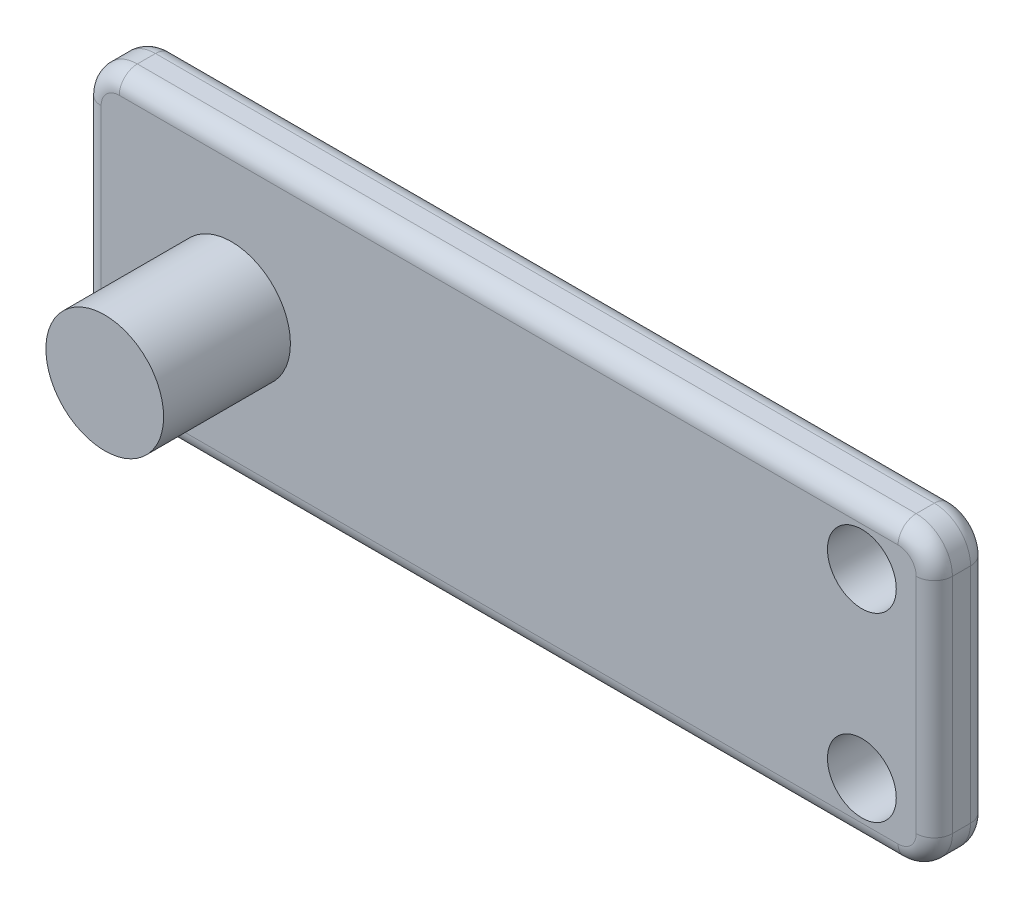
ISO-10303-21;
HEADER;
FILE_DESCRIPTION(('STEP AP214'),'2;1');
FILE_NAME('part.step','',(''),(''),'','','');
FILE_SCHEMA(('AUTOMOTIVE_DESIGN { 1 0 10303 214 1 1 1 1 }'));
ENDSEC;
DATA;
#1=APPLICATION_CONTEXT('core data for automotive mechanical design processes');
#2=APPLICATION_PROTOCOL_DEFINITION('international standard','automotive_design',2000,#1);
#3=PRODUCT_CONTEXT('',#1,'mechanical');
#4=PRODUCT('Part','Part','',(#3));
#5=PRODUCT_RELATED_PRODUCT_CATEGORY('part','',(#4));
#6=PRODUCT_DEFINITION_FORMATION('','',#4);
#7=PRODUCT_DEFINITION_CONTEXT('part definition',#1,'design');
#8=PRODUCT_DEFINITION('design','',#6,#7);
#9=PRODUCT_DEFINITION_SHAPE('','',#8);
#10=(LENGTH_UNIT() NAMED_UNIT(*) SI_UNIT(.MILLI.,.METRE.));
#11=(NAMED_UNIT(*) PLANE_ANGLE_UNIT() SI_UNIT($,.RADIAN.));
#12=(NAMED_UNIT(*) SI_UNIT($,.STERADIAN.) SOLID_ANGLE_UNIT());
#13=UNCERTAINTY_MEASURE_WITH_UNIT(LENGTH_MEASURE(1.E-05),#10,'distance_accuracy_value','');
#14=(GEOMETRIC_REPRESENTATION_CONTEXT(3) GLOBAL_UNCERTAINTY_ASSIGNED_CONTEXT((#13)) GLOBAL_UNIT_ASSIGNED_CONTEXT((#10,
#11,#12)) REPRESENTATION_CONTEXT('',''));
#15=CARTESIAN_POINT('',(0.,0.,0.));
#16=DIRECTION('',(0.,0.,1.));
#17=DIRECTION('',(1.,0.,0.));
#18=AXIS2_PLACEMENT_3D('',#15,#16,#17);
#19=CARTESIAN_POINT('',(0.,0.,3.));
#20=DIRECTION('',(0.,0.,1.));
#21=DIRECTION('',(1.,0.,0.));
#22=AXIS2_PLACEMENT_3D('',#19,#20,#21);
#23=PLANE('',#22);
#24=CARTESIAN_POINT('',(-15.3,0.,3.));
#25=DIRECTION('',(0.,0.,1.));
#26=DIRECTION('',(1.,0.,0.));
#27=AXIS2_PLACEMENT_3D('',#24,#25,#26);
#28=CIRCLE('',#27,3.25);
#29=CARTESIAN_POINT('',(-12.05,0.,3.));
#30=VERTEX_POINT('',#29);
#31=EDGE_CURVE('E728',#30,#30,#28,.F.);
#32=ORIENTED_EDGE('',*,*,#31,.T.);
#33=EDGE_LOOP('',(#32));
#34=FACE_BOUND('',#33,.T.);
#35=CARTESIAN_POINT('',(19.5,5.,3.));
#36=DIRECTION('',(0.,0.,1.));
#37=DIRECTION('',(1.,0.,0.));
#38=AXIS2_PLACEMENT_3D('',#35,#36,#37);
#39=CIRCLE('',#38,1.9);
#40=CARTESIAN_POINT('',(21.4,5.,3.));
#41=VERTEX_POINT('',#40);
#42=EDGE_CURVE('E701',#41,#41,#39,.T.);
#43=ORIENTED_EDGE('',*,*,#42,.F.);
#44=EDGE_LOOP('',(#43));
#45=FACE_BOUND('',#44,.T.);
#46=CARTESIAN_POINT('',(19.5,-5.,3.));
#47=DIRECTION('',(0.,0.,1.));
#48=DIRECTION('',(1.,0.,0.));
#49=AXIS2_PLACEMENT_3D('',#46,#47,#48);
#50=CIRCLE('',#49,1.9);
#51=CARTESIAN_POINT('',(21.4,-5.,3.));
#52=VERTEX_POINT('',#51);
#53=EDGE_CURVE('E706',#52,#52,#50,.T.);
#54=ORIENTED_EDGE('',*,*,#53,.F.);
#55=EDGE_LOOP('',(#54));
#56=FACE_BOUND('',#55,.T.);
#57=CARTESIAN_POINT('',(-21.5,-6.15,3.));
#58=DIRECTION('',(0.,0.,1.));
#59=DIRECTION('',(1.,0.,0.));
#60=AXIS2_PLACEMENT_3D('',#57,#58,#59);
#61=CIRCLE('',#60,1.);
#62=CARTESIAN_POINT('',(-21.5,-7.15,3.));
#63=VERTEX_POINT('',#62);
#64=CARTESIAN_POINT('',(-22.5,-6.15,3.));
#65=VERTEX_POINT('',#64);
#66=EDGE_CURVE('E319',#63,#65,#61,.F.);
#67=ORIENTED_EDGE('',*,*,#66,.F.);
#68=DIRECTION('',(1.,0.,0.));
#69=VECTOR('',#68,1.);
#70=CARTESIAN_POINT('',(23.5,-7.15,3.));
#71=LINE('',#70,#69);
#72=CARTESIAN_POINT('',(21.5,-7.15,3.));
#73=VERTEX_POINT('',#72);
#74=EDGE_CURVE('E279',#63,#73,#71,.T.);
#75=ORIENTED_EDGE('',*,*,#74,.T.);
#76=CARTESIAN_POINT('',(21.5,-6.15,3.));
#77=DIRECTION('',(0.,0.,1.));
#78=DIRECTION('',(1.,0.,0.));
#79=AXIS2_PLACEMENT_3D('',#76,#77,#78);
#80=CIRCLE('',#79,1.);
#81=CARTESIAN_POINT('',(22.5,-6.15,3.));
#82=VERTEX_POINT('',#81);
#83=EDGE_CURVE('E277',#82,#73,#80,.F.);
#84=ORIENTED_EDGE('',*,*,#83,.F.);
#85=DIRECTION('',(0.,1.,0.));
#86=VECTOR('',#85,1.);
#87=CARTESIAN_POINT('',(22.5,8.15,3.));
#88=LINE('',#87,#86);
#89=CARTESIAN_POINT('',(22.5,6.15,3.));
#90=VERTEX_POINT('',#89);
#91=EDGE_CURVE('E270',#82,#90,#88,.T.);
#92=ORIENTED_EDGE('',*,*,#91,.T.);
#93=CARTESIAN_POINT('',(21.5,6.15,3.));
#94=DIRECTION('',(0.,0.,1.));
#95=DIRECTION('',(1.,0.,0.));
#96=AXIS2_PLACEMENT_3D('',#93,#94,#95);
#97=CIRCLE('',#96,1.);
#98=CARTESIAN_POINT('',(21.5,7.15,3.));
#99=VERTEX_POINT('',#98);
#100=EDGE_CURVE('E267',#99,#90,#97,.F.);
#101=ORIENTED_EDGE('',*,*,#100,.F.);
#102=DIRECTION('',(-1.,0.,0.));
#103=VECTOR('',#102,1.);
#104=CARTESIAN_POINT('',(-23.5,7.15,3.));
#105=LINE('',#104,#103);
#106=CARTESIAN_POINT('',(-21.5,7.15,3.));
#107=VERTEX_POINT('',#106);
#108=EDGE_CURVE('E293',#99,#107,#105,.T.);
#109=ORIENTED_EDGE('',*,*,#108,.T.);
#110=CARTESIAN_POINT('',(-21.5,6.15,3.));
#111=DIRECTION('',(0.,0.,1.));
#112=DIRECTION('',(1.,0.,0.));
#113=AXIS2_PLACEMENT_3D('',#110,#111,#112);
#114=CIRCLE('',#113,1.);
#115=CARTESIAN_POINT('',(-22.5,6.15,3.));
#116=VERTEX_POINT('',#115);
#117=EDGE_CURVE('E315',#116,#107,#114,.F.);
#118=ORIENTED_EDGE('',*,*,#117,.F.);
#119=DIRECTION('',(0.,-1.,0.));
#120=VECTOR('',#119,1.);
#121=CARTESIAN_POINT('',(-22.5,-8.15,3.));
#122=LINE('',#121,#120);
#123=EDGE_CURVE('E284',#116,#65,#122,.T.);
#124=ORIENTED_EDGE('',*,*,#123,.T.);
#125=EDGE_LOOP('',(#67,#75,#84,#92,#101,#109,#118,#124));
#126=FACE_BOUND('',#125,.T.);
#127=ADVANCED_FACE('F47',(#34,#45,#56,#126),#23,.T.);
#128=CARTESIAN_POINT('',(0.,0.,0.));
#129=DIRECTION('',(0.,0.,1.));
#130=DIRECTION('',(1.,0.,0.));
#131=AXIS2_PLACEMENT_3D('',#128,#129,#130);
#132=PLANE('',#131);
#133=CARTESIAN_POINT('',(19.5,5.,0.));
#134=DIRECTION('',(0.,0.,1.));
#135=DIRECTION('',(1.,0.,0.));
#136=AXIS2_PLACEMENT_3D('',#133,#134,#135);
#137=CIRCLE('',#136,1.9);
#138=CARTESIAN_POINT('',(21.4,5.,0.));
#139=VERTEX_POINT('',#138);
#140=EDGE_CURVE('E704',#139,#139,#137,.T.);
#141=ORIENTED_EDGE('',*,*,#140,.T.);
#142=EDGE_LOOP('',(#141));
#143=FACE_BOUND('',#142,.T.);
#144=CARTESIAN_POINT('',(19.5,-5.,0.));
#145=DIRECTION('',(0.,0.,1.));
#146=DIRECTION('',(1.,0.,0.));
#147=AXIS2_PLACEMENT_3D('',#144,#145,#146);
#148=CIRCLE('',#147,1.9);
#149=CARTESIAN_POINT('',(21.4,-5.,0.));
#150=VERTEX_POINT('',#149);
#151=EDGE_CURVE('E712',#150,#150,#148,.T.);
#152=ORIENTED_EDGE('',*,*,#151,.T.);
#153=EDGE_LOOP('',(#152));
#154=FACE_BOUND('',#153,.T.);
#155=CARTESIAN_POINT('',(-21.5,-6.15,0.));
#156=DIRECTION('',(0.,0.,1.));
#157=DIRECTION('',(1.,0.,0.));
#158=AXIS2_PLACEMENT_3D('',#155,#156,#157);
#159=CIRCLE('',#158,1.);
#160=CARTESIAN_POINT('',(-22.5,-6.15,0.));
#161=VERTEX_POINT('',#160);
#162=CARTESIAN_POINT('',(-21.5,-7.15,0.));
#163=VERTEX_POINT('',#162);
#164=EDGE_CURVE('E176',#161,#163,#159,.T.);
#165=ORIENTED_EDGE('',*,*,#164,.F.);
#166=DIRECTION('',(0.,-1.,0.));
#167=VECTOR('',#166,1.);
#168=CARTESIAN_POINT('',(-22.5,0.,0.));
#169=LINE('',#168,#167);
#170=CARTESIAN_POINT('',(-22.5,6.15,0.));
#171=VERTEX_POINT('',#170);
#172=EDGE_CURVE('E170',#161,#171,#169,.F.);
#173=ORIENTED_EDGE('',*,*,#172,.T.);
#174=CARTESIAN_POINT('',(-21.5,6.15,0.));
#175=DIRECTION('',(0.,0.,1.));
#176=DIRECTION('',(1.,0.,0.));
#177=AXIS2_PLACEMENT_3D('',#174,#175,#176);
#178=CIRCLE('',#177,1.);
#179=CARTESIAN_POINT('',(-21.5,7.15,0.));
#180=VERTEX_POINT('',#179);
#181=EDGE_CURVE('E164',#180,#171,#178,.T.);
#182=ORIENTED_EDGE('',*,*,#181,.F.);
#183=DIRECTION('',(-1.,0.,0.));
#184=VECTOR('',#183,1.);
#185=CARTESIAN_POINT('',(0.,7.15,0.));
#186=LINE('',#185,#184);
#187=CARTESIAN_POINT('',(21.5,7.15,0.));
#188=VERTEX_POINT('',#187);
#189=EDGE_CURVE('E168',#180,#188,#186,.F.);
#190=ORIENTED_EDGE('',*,*,#189,.T.);
#191=CARTESIAN_POINT('',(21.5,6.15,0.));
#192=DIRECTION('',(0.,0.,1.));
#193=DIRECTION('',(1.,0.,0.));
#194=AXIS2_PLACEMENT_3D('',#191,#192,#193);
#195=CIRCLE('',#194,1.);
#196=CARTESIAN_POINT('',(22.5,6.15,0.));
#197=VERTEX_POINT('',#196);
#198=EDGE_CURVE('E296',#197,#188,#195,.T.);
#199=ORIENTED_EDGE('',*,*,#198,.F.);
#200=DIRECTION('',(0.,1.,0.));
#201=VECTOR('',#200,1.);
#202=CARTESIAN_POINT('',(22.5,0.,0.));
#203=LINE('',#202,#201);
#204=CARTESIAN_POINT('',(22.5,-6.15,0.));
#205=VERTEX_POINT('',#204);
#206=EDGE_CURVE('E364',#197,#205,#203,.F.);
#207=ORIENTED_EDGE('',*,*,#206,.T.);
#208=CARTESIAN_POINT('',(21.5,-6.15,0.));
#209=DIRECTION('',(0.,0.,1.));
#210=DIRECTION('',(1.,0.,0.));
#211=AXIS2_PLACEMENT_3D('',#208,#209,#210);
#212=CIRCLE('',#211,1.);
#213=CARTESIAN_POINT('',(21.5,-7.15,0.));
#214=VERTEX_POINT('',#213);
#215=EDGE_CURVE('E177',#214,#205,#212,.T.);
#216=ORIENTED_EDGE('',*,*,#215,.F.);
#217=DIRECTION('',(1.,0.,0.));
#218=VECTOR('',#217,1.);
#219=CARTESIAN_POINT('',(0.,-7.15,0.));
#220=LINE('',#219,#218);
#221=EDGE_CURVE('E379',#214,#163,#220,.F.);
#222=ORIENTED_EDGE('',*,*,#221,.T.);
#223=EDGE_LOOP('',(#165,#173,#182,#190,#199,#207,#216,#222));
#224=FACE_BOUND('',#223,.T.);
#225=ADVANCED_FACE('F167',(#143,#154,#224),#132,.F.);
#226=CARTESIAN_POINT('',(23.5,8.15,3.));
#227=DIRECTION('',(-1.,0.,0.));
#228=DIRECTION('',(0.,0.,1.));
#229=AXIS2_PLACEMENT_3D('',#226,#227,#228);
#230=PLANE('',#229);
#231=DIRECTION('',(0.,1.,0.));
#232=VECTOR('',#231,1.);
#233=CARTESIAN_POINT('',(23.5,8.15,1.));
#234=LINE('',#233,#232);
#235=CARTESIAN_POINT('',(23.5,-6.15,1.));
#236=VERTEX_POINT('',#235);
#237=CARTESIAN_POINT('',(23.5,6.15,1.));
#238=VERTEX_POINT('',#237);
#239=EDGE_CURVE('E188',#236,#238,#234,.T.);
#240=ORIENTED_EDGE('',*,*,#239,.T.);
#241=DIRECTION('',(0.,0.,-1.));
#242=VECTOR('',#241,1.);
#243=CARTESIAN_POINT('',(23.5,6.15,3.));
#244=LINE('',#243,#242);
#245=CARTESIAN_POINT('',(23.5,6.15,2.));
#246=VERTEX_POINT('',#245);
#247=EDGE_CURVE('E72',#238,#246,#244,.F.);
#248=ORIENTED_EDGE('',*,*,#247,.T.);
#249=DIRECTION('',(0.,1.,0.));
#250=VECTOR('',#249,1.);
#251=CARTESIAN_POINT('',(23.5,-8.15,2.));
#252=LINE('',#251,#250);
#253=CARTESIAN_POINT('',(23.5,-6.15,2.));
#254=VERTEX_POINT('',#253);
#255=EDGE_CURVE('E271',#246,#254,#252,.F.);
#256=ORIENTED_EDGE('',*,*,#255,.T.);
#257=DIRECTION('',(0.,0.,-1.));
#258=VECTOR('',#257,1.);
#259=CARTESIAN_POINT('',(23.5,-6.15,3.));
#260=LINE('',#259,#258);
#261=EDGE_CURVE('E215',#254,#236,#260,.T.);
#262=ORIENTED_EDGE('',*,*,#261,.T.);
#263=EDGE_LOOP('',(#240,#248,#256,#262));
#264=FACE_BOUND('',#263,.T.);
#265=ADVANCED_FACE('F439',(#264),#230,.F.);
#266=CARTESIAN_POINT('',(-23.5,8.15,3.));
#267=DIRECTION('',(0.,-1.,0.));
#268=DIRECTION('',(0.,0.,-1.));
#269=AXIS2_PLACEMENT_3D('',#266,#267,#268);
#270=PLANE('',#269);
#271=DIRECTION('',(-1.,0.,0.));
#272=VECTOR('',#271,1.);
#273=CARTESIAN_POINT('',(23.5,8.15,2.));
#274=LINE('',#273,#272);
#275=CARTESIAN_POINT('',(-21.5,8.15,2.));
#276=VERTEX_POINT('',#275);
#277=CARTESIAN_POINT('',(21.5,8.15,2.));
#278=VERTEX_POINT('',#277);
#279=EDGE_CURVE('E286',#276,#278,#274,.F.);
#280=ORIENTED_EDGE('',*,*,#279,.T.);
#281=DIRECTION('',(0.,0.,-1.));
#282=VECTOR('',#281,1.);
#283=CARTESIAN_POINT('',(21.5,8.15,3.));
#284=LINE('',#283,#282);
#285=CARTESIAN_POINT('',(21.5,8.15,1.));
#286=VERTEX_POINT('',#285);
#287=EDGE_CURVE('E212',#278,#286,#284,.T.);
#288=ORIENTED_EDGE('',*,*,#287,.T.);
#289=DIRECTION('',(-1.,0.,0.));
#290=VECTOR('',#289,1.);
#291=CARTESIAN_POINT('',(-23.5,8.15,1.));
#292=LINE('',#291,#290);
#293=CARTESIAN_POINT('',(-21.5,8.15,1.));
#294=VERTEX_POINT('',#293);
#295=EDGE_CURVE('E280',#286,#294,#292,.T.);
#296=ORIENTED_EDGE('',*,*,#295,.T.);
#297=DIRECTION('',(0.,0.,-1.));
#298=VECTOR('',#297,1.);
#299=CARTESIAN_POINT('',(-21.5,8.15,3.));
#300=LINE('',#299,#298);
#301=EDGE_CURVE('E209',#294,#276,#300,.F.);
#302=ORIENTED_EDGE('',*,*,#301,.T.);
#303=EDGE_LOOP('',(#280,#288,#296,#302));
#304=FACE_BOUND('',#303,.T.);
#305=ADVANCED_FACE('F402',(#304),#270,.F.);
#306=CARTESIAN_POINT('',(-23.5,8.15,3.));
#307=DIRECTION('',(1.,0.,0.));
#308=DIRECTION('',(0.,0.,-1.));
#309=AXIS2_PLACEMENT_3D('',#306,#307,#308);
#310=PLANE('',#309);
#311=DIRECTION('',(0.,-1.,0.));
#312=VECTOR('',#311,1.);
#313=CARTESIAN_POINT('',(-23.5,8.15,2.));
#314=LINE('',#313,#312);
#315=CARTESIAN_POINT('',(-23.5,-6.15,2.));
#316=VERTEX_POINT('',#315);
#317=CARTESIAN_POINT('',(-23.5,6.15,2.));
#318=VERTEX_POINT('',#317);
#319=EDGE_CURVE('E391',#316,#318,#314,.F.);
#320=ORIENTED_EDGE('',*,*,#319,.T.);
#321=DIRECTION('',(0.,0.,-1.));
#322=VECTOR('',#321,1.);
#323=CARTESIAN_POINT('',(-23.5,6.15,3.));
#324=LINE('',#323,#322);
#325=CARTESIAN_POINT('',(-23.5,6.15,1.));
#326=VERTEX_POINT('',#325);
#327=EDGE_CURVE('E11',#318,#326,#324,.T.);
#328=ORIENTED_EDGE('',*,*,#327,.T.);
#329=DIRECTION('',(0.,-1.,0.));
#330=VECTOR('',#329,1.);
#331=CARTESIAN_POINT('',(-23.5,8.15,1.));
#332=LINE('',#331,#330);
#333=CARTESIAN_POINT('',(-23.5,-6.15,1.));
#334=VERTEX_POINT('',#333);
#335=EDGE_CURVE('E395',#326,#334,#332,.T.);
#336=ORIENTED_EDGE('',*,*,#335,.T.);
#337=DIRECTION('',(0.,0.,-1.));
#338=VECTOR('',#337,1.);
#339=CARTESIAN_POINT('',(-23.5,-6.15,3.));
#340=LINE('',#339,#338);
#341=EDGE_CURVE('E57',#334,#316,#340,.F.);
#342=ORIENTED_EDGE('',*,*,#341,.T.);
#343=EDGE_LOOP('',(#320,#328,#336,#342));
#344=FACE_BOUND('',#343,.T.);
#345=ADVANCED_FACE('F416',(#344),#310,.F.);
#346=CARTESIAN_POINT('',(-23.5,-8.15,3.));
#347=DIRECTION('',(0.,1.,0.));
#348=DIRECTION('',(0.,0.,1.));
#349=AXIS2_PLACEMENT_3D('',#346,#347,#348);
#350=PLANE('',#349);
#351=DIRECTION('',(1.,0.,0.));
#352=VECTOR('',#351,1.);
#353=CARTESIAN_POINT('',(-23.5,-8.15,1.));
#354=LINE('',#353,#352);
#355=CARTESIAN_POINT('',(-21.5,-8.15,1.));
#356=VERTEX_POINT('',#355);
#357=CARTESIAN_POINT('',(21.5,-8.15,1.));
#358=VERTEX_POINT('',#357);
#359=EDGE_CURVE('E363',#356,#358,#354,.T.);
#360=ORIENTED_EDGE('',*,*,#359,.T.);
#361=DIRECTION('',(0.,0.,-1.));
#362=VECTOR('',#361,1.);
#363=CARTESIAN_POINT('',(21.5,-8.15,3.));
#364=LINE('',#363,#362);
#365=CARTESIAN_POINT('',(21.5,-8.15,2.));
#366=VERTEX_POINT('',#365);
#367=EDGE_CURVE('E223',#358,#366,#364,.F.);
#368=ORIENTED_EDGE('',*,*,#367,.T.);
#369=DIRECTION('',(1.,0.,0.));
#370=VECTOR('',#369,1.);
#371=CARTESIAN_POINT('',(-23.5,-8.15,2.));
#372=LINE('',#371,#370);
#373=CARTESIAN_POINT('',(-21.5,-8.15,2.));
#374=VERTEX_POINT('',#373);
#375=EDGE_CURVE('E352',#366,#374,#372,.F.);
#376=ORIENTED_EDGE('',*,*,#375,.T.);
#377=DIRECTION('',(0.,0.,-1.));
#378=VECTOR('',#377,1.);
#379=CARTESIAN_POINT('',(-21.5,-8.15,3.));
#380=LINE('',#379,#378);
#381=EDGE_CURVE('E220',#374,#356,#380,.T.);
#382=ORIENTED_EDGE('',*,*,#381,.T.);
#383=EDGE_LOOP('',(#360,#368,#376,#382));
#384=FACE_BOUND('',#383,.T.);
#385=ADVANCED_FACE('F358',(#384),#350,.F.);
#386=CARTESIAN_POINT('',(19.5,5.,3.));
#387=DIRECTION('',(0.,0.,-1.));
#388=DIRECTION('',(-1.,0.,0.));
#389=AXIS2_PLACEMENT_3D('',#386,#387,#388);
#390=CYLINDRICAL_SURFACE('',#389,1.9);
#391=ORIENTED_EDGE('',*,*,#42,.T.);
#392=EDGE_LOOP('',(#391));
#393=FACE_BOUND('',#392,.T.);
#394=ORIENTED_EDGE('',*,*,#140,.F.);
#395=EDGE_LOOP('',(#394));
#396=FACE_BOUND('',#395,.T.);
#397=ADVANCED_FACE('F445',(#393,#396),#390,.F.);
#398=CARTESIAN_POINT('',(19.5,-5.,3.));
#399=DIRECTION('',(0.,0.,-1.));
#400=DIRECTION('',(-1.,0.,0.));
#401=AXIS2_PLACEMENT_3D('',#398,#399,#400);
#402=CYLINDRICAL_SURFACE('',#401,1.9);
#403=ORIENTED_EDGE('',*,*,#53,.T.);
#404=EDGE_LOOP('',(#403));
#405=FACE_BOUND('',#404,.T.);
#406=ORIENTED_EDGE('',*,*,#151,.F.);
#407=EDGE_LOOP('',(#406));
#408=FACE_BOUND('',#407,.T.);
#409=ADVANCED_FACE('F651',(#405,#408),#402,.F.);
#410=CARTESIAN_POINT('',(-15.3,0.,10.));
#411=DIRECTION('',(0.,0.,-1.));
#412=DIRECTION('',(-1.,0.,0.));
#413=AXIS2_PLACEMENT_3D('',#410,#411,#412);
#414=CYLINDRICAL_SURFACE('',#413,3.25);
#415=ORIENTED_EDGE('',*,*,#31,.F.);
#416=EDGE_LOOP('',(#415));
#417=FACE_BOUND('',#416,.T.);
#418=CARTESIAN_POINT('',(-15.3,0.,10.));
#419=DIRECTION('',(0.,0.,1.));
#420=DIRECTION('',(1.,0.,0.));
#421=AXIS2_PLACEMENT_3D('',#418,#419,#420);
#422=CIRCLE('',#421,3.25);
#423=CARTESIAN_POINT('',(-12.05,0.,10.));
#424=VERTEX_POINT('',#423);
#425=EDGE_CURVE('E237',#424,#424,#422,.T.);
#426=ORIENTED_EDGE('',*,*,#425,.F.);
#427=EDGE_LOOP('',(#426));
#428=FACE_BOUND('',#427,.T.);
#429=ADVANCED_FACE('F429',(#417,#428),#414,.T.);
#430=CARTESIAN_POINT('',(-15.3,0.,10.));
#431=DIRECTION('',(0.,0.,1.));
#432=DIRECTION('',(1.,0.,0.));
#433=AXIS2_PLACEMENT_3D('',#430,#431,#432);
#434=PLANE('',#433);
#435=ORIENTED_EDGE('',*,*,#425,.T.);
#436=EDGE_LOOP('',(#435));
#437=FACE_BOUND('',#436,.T.);
#438=ADVANCED_FACE('F421',(#437),#434,.T.);
#439=CARTESIAN_POINT('',(-22.5,8.15,1.));
#440=DIRECTION('',(0.,-1.,0.));
#441=DIRECTION('',(0.,0.,-1.));
#442=AXIS2_PLACEMENT_3D('',#439,#440,#441);
#443=CYLINDRICAL_SURFACE('',#442,1.);
#444=ORIENTED_EDGE('',*,*,#335,.F.);
#445=CARTESIAN_POINT('',(-22.5,6.15,1.));
#446=DIRECTION('',(0.,-1.,0.));
#447=DIRECTION('',(0.,0.,-1.));
#448=AXIS2_PLACEMENT_3D('',#445,#446,#447);
#449=CIRCLE('',#448,1.);
#450=EDGE_CURVE('E332',#326,#171,#449,.T.);
#451=ORIENTED_EDGE('',*,*,#450,.T.);
#452=ORIENTED_EDGE('',*,*,#172,.F.);
#453=CARTESIAN_POINT('',(-22.5,-6.15,1.));
#454=DIRECTION('',(0.,1.,0.));
#455=DIRECTION('',(0.,0.,1.));
#456=AXIS2_PLACEMENT_3D('',#453,#454,#455);
#457=CIRCLE('',#456,1.);
#458=EDGE_CURVE('E329',#161,#334,#457,.T.);
#459=ORIENTED_EDGE('',*,*,#458,.T.);
#460=EDGE_LOOP('',(#444,#451,#452,#459));
#461=FACE_BOUND('',#460,.T.);
#462=ADVANCED_FACE('F419',(#461),#443,.T.);
#463=CARTESIAN_POINT('',(-23.5,-7.15,1.));
#464=DIRECTION('',(1.,0.,0.));
#465=DIRECTION('',(0.,0.,-1.));
#466=AXIS2_PLACEMENT_3D('',#463,#464,#465);
#467=CYLINDRICAL_SURFACE('',#466,1.);
#468=ORIENTED_EDGE('',*,*,#359,.F.);
#469=CARTESIAN_POINT('',(-21.5,-7.15,1.));
#470=DIRECTION('',(1.,0.,0.));
#471=DIRECTION('',(0.,0.,-1.));
#472=AXIS2_PLACEMENT_3D('',#469,#470,#471);
#473=CIRCLE('',#472,1.);
#474=EDGE_CURVE('E308',#356,#163,#473,.T.);
#475=ORIENTED_EDGE('',*,*,#474,.T.);
#476=ORIENTED_EDGE('',*,*,#221,.F.);
#477=CARTESIAN_POINT('',(21.5,-7.15,1.));
#478=DIRECTION('',(-1.,0.,0.));
#479=DIRECTION('',(0.,0.,1.));
#480=AXIS2_PLACEMENT_3D('',#477,#478,#479);
#481=CIRCLE('',#480,1.);
#482=EDGE_CURVE('E305',#214,#358,#481,.T.);
#483=ORIENTED_EDGE('',*,*,#482,.T.);
#484=EDGE_LOOP('',(#468,#475,#476,#483));
#485=FACE_BOUND('',#484,.T.);
#486=ADVANCED_FACE('F378',(#485),#467,.T.);
#487=CARTESIAN_POINT('',(-23.5,7.15,1.));
#488=DIRECTION('',(-1.,0.,0.));
#489=DIRECTION('',(0.,0.,1.));
#490=AXIS2_PLACEMENT_3D('',#487,#488,#489);
#491=CYLINDRICAL_SURFACE('',#490,1.);
#492=ORIENTED_EDGE('',*,*,#295,.F.);
#493=CARTESIAN_POINT('',(21.5,7.15,1.));
#494=DIRECTION('',(-1.,0.,0.));
#495=DIRECTION('',(0.,0.,1.));
#496=AXIS2_PLACEMENT_3D('',#493,#494,#495);
#497=CIRCLE('',#496,1.);
#498=EDGE_CURVE('E186',#286,#188,#497,.T.);
#499=ORIENTED_EDGE('',*,*,#498,.T.);
#500=ORIENTED_EDGE('',*,*,#189,.F.);
#501=CARTESIAN_POINT('',(-21.5,7.15,1.));
#502=DIRECTION('',(1.,0.,0.));
#503=DIRECTION('',(0.,0.,-1.));
#504=AXIS2_PLACEMENT_3D('',#501,#502,#503);
#505=CIRCLE('',#504,1.);
#506=EDGE_CURVE('E183',#180,#294,#505,.T.);
#507=ORIENTED_EDGE('',*,*,#506,.T.);
#508=EDGE_LOOP('',(#492,#499,#500,#507));
#509=FACE_BOUND('',#508,.T.);
#510=ADVANCED_FACE('F182',(#509),#491,.T.);
#511=CARTESIAN_POINT('',(22.5,8.15,1.));
#512=DIRECTION('',(0.,1.,0.));
#513=DIRECTION('',(0.,0.,1.));
#514=AXIS2_PLACEMENT_3D('',#511,#512,#513);
#515=CYLINDRICAL_SURFACE('',#514,1.);
#516=ORIENTED_EDGE('',*,*,#239,.F.);
#517=CARTESIAN_POINT('',(22.5,-6.15,1.));
#518=DIRECTION('',(0.,1.,0.));
#519=DIRECTION('',(0.,0.,1.));
#520=AXIS2_PLACEMENT_3D('',#517,#518,#519);
#521=CIRCLE('',#520,1.);
#522=EDGE_CURVE('E343',#236,#205,#521,.T.);
#523=ORIENTED_EDGE('',*,*,#522,.T.);
#524=ORIENTED_EDGE('',*,*,#206,.F.);
#525=CARTESIAN_POINT('',(22.5,6.15,1.));
#526=DIRECTION('',(0.,-1.,0.));
#527=DIRECTION('',(0.,0.,-1.));
#528=AXIS2_PLACEMENT_3D('',#525,#526,#527);
#529=CIRCLE('',#528,1.);
#530=EDGE_CURVE('E340',#197,#238,#529,.T.);
#531=ORIENTED_EDGE('',*,*,#530,.T.);
#532=EDGE_LOOP('',(#516,#523,#524,#531));
#533=FACE_BOUND('',#532,.T.);
#534=ADVANCED_FACE('F455',(#533),#515,.T.);
#535=CARTESIAN_POINT('',(0.,-7.15,2.));
#536=DIRECTION('',(-1.,0.,0.));
#537=DIRECTION('',(0.,0.,1.));
#538=AXIS2_PLACEMENT_3D('',#535,#536,#537);
#539=CYLINDRICAL_SURFACE('',#538,1.);
#540=ORIENTED_EDGE('',*,*,#375,.F.);
#541=CARTESIAN_POINT('',(21.5,-7.15,2.));
#542=DIRECTION('',(-1.,0.,0.));
#543=DIRECTION('',(0.,0.,1.));
#544=AXIS2_PLACEMENT_3D('',#541,#542,#543);
#545=CIRCLE('',#544,1.);
#546=EDGE_CURVE('E195',#366,#73,#545,.T.);
#547=ORIENTED_EDGE('',*,*,#546,.T.);
#548=ORIENTED_EDGE('',*,*,#74,.F.);
#549=CARTESIAN_POINT('',(-21.5,-7.15,2.));
#550=DIRECTION('',(1.,0.,0.));
#551=DIRECTION('',(0.,0.,-1.));
#552=AXIS2_PLACEMENT_3D('',#549,#550,#551);
#553=CIRCLE('',#552,1.);
#554=EDGE_CURVE('E200',#63,#374,#553,.T.);
#555=ORIENTED_EDGE('',*,*,#554,.T.);
#556=EDGE_LOOP('',(#540,#547,#548,#555));
#557=FACE_BOUND('',#556,.T.);
#558=ADVANCED_FACE('F351',(#557),#539,.T.);
#559=CARTESIAN_POINT('',(22.5,0.,2.));
#560=DIRECTION('',(0.,-1.,0.));
#561=DIRECTION('',(0.,0.,-1.));
#562=AXIS2_PLACEMENT_3D('',#559,#560,#561);
#563=CYLINDRICAL_SURFACE('',#562,1.);
#564=ORIENTED_EDGE('',*,*,#255,.F.);
#565=CARTESIAN_POINT('',(22.5,6.15,2.));
#566=DIRECTION('',(0.,-1.,0.));
#567=DIRECTION('',(0.,0.,-1.));
#568=AXIS2_PLACEMENT_3D('',#565,#566,#567);
#569=CIRCLE('',#568,1.);
#570=EDGE_CURVE('E206',#246,#90,#569,.T.);
#571=ORIENTED_EDGE('',*,*,#570,.T.);
#572=ORIENTED_EDGE('',*,*,#91,.F.);
#573=CARTESIAN_POINT('',(22.5,-6.15,2.));
#574=DIRECTION('',(0.,1.,0.));
#575=DIRECTION('',(0.,0.,1.));
#576=AXIS2_PLACEMENT_3D('',#573,#574,#575);
#577=CIRCLE('',#576,1.);
#578=EDGE_CURVE('E65',#82,#254,#577,.T.);
#579=ORIENTED_EDGE('',*,*,#578,.T.);
#580=EDGE_LOOP('',(#564,#571,#572,#579));
#581=FACE_BOUND('',#580,.T.);
#582=ADVANCED_FACE('F269',(#581),#563,.T.);
#583=CARTESIAN_POINT('',(-22.5,0.,2.));
#584=DIRECTION('',(0.,1.,0.));
#585=DIRECTION('',(0.,0.,1.));
#586=AXIS2_PLACEMENT_3D('',#583,#584,#585);
#587=CYLINDRICAL_SURFACE('',#586,1.);
#588=ORIENTED_EDGE('',*,*,#319,.F.);
#589=CARTESIAN_POINT('',(-22.5,-6.15,2.));
#590=DIRECTION('',(0.,1.,0.));
#591=DIRECTION('',(0.,0.,1.));
#592=AXIS2_PLACEMENT_3D('',#589,#590,#591);
#593=CIRCLE('',#592,1.);
#594=EDGE_CURVE('E326',#316,#65,#593,.T.);
#595=ORIENTED_EDGE('',*,*,#594,.T.);
#596=ORIENTED_EDGE('',*,*,#123,.F.);
#597=CARTESIAN_POINT('',(-22.5,6.15,2.));
#598=DIRECTION('',(0.,-1.,0.));
#599=DIRECTION('',(0.,0.,-1.));
#600=AXIS2_PLACEMENT_3D('',#597,#598,#599);
#601=CIRCLE('',#600,1.);
#602=EDGE_CURVE('E323',#116,#318,#601,.T.);
#603=ORIENTED_EDGE('',*,*,#602,.T.);
#604=EDGE_LOOP('',(#588,#595,#596,#603));
#605=FACE_BOUND('',#604,.T.);
#606=ADVANCED_FACE('F483',(#605),#587,.T.);
#607=CARTESIAN_POINT('',(0.,7.15,2.));
#608=DIRECTION('',(1.,0.,0.));
#609=DIRECTION('',(0.,0.,-1.));
#610=AXIS2_PLACEMENT_3D('',#607,#608,#609);
#611=CYLINDRICAL_SURFACE('',#610,1.);
#612=ORIENTED_EDGE('',*,*,#279,.F.);
#613=CARTESIAN_POINT('',(-21.5,7.15,2.));
#614=DIRECTION('',(1.,0.,0.));
#615=DIRECTION('',(0.,0.,-1.));
#616=AXIS2_PLACEMENT_3D('',#613,#614,#615);
#617=CIRCLE('',#616,1.);
#618=EDGE_CURVE('E337',#276,#107,#617,.T.);
#619=ORIENTED_EDGE('',*,*,#618,.T.);
#620=ORIENTED_EDGE('',*,*,#108,.F.);
#621=CARTESIAN_POINT('',(21.5,7.15,2.));
#622=DIRECTION('',(-1.,0.,0.));
#623=DIRECTION('',(0.,0.,1.));
#624=AXIS2_PLACEMENT_3D('',#621,#622,#623);
#625=CIRCLE('',#624,1.);
#626=EDGE_CURVE('E266',#99,#278,#625,.T.);
#627=ORIENTED_EDGE('',*,*,#626,.T.);
#628=EDGE_LOOP('',(#612,#619,#620,#627));
#629=FACE_BOUND('',#628,.T.);
#630=ADVANCED_FACE('F406',(#629),#611,.T.);
#631=CARTESIAN_POINT('',(-21.5,-6.15,2.));
#632=DIRECTION('',(0.,0.,1.));
#633=DIRECTION('',(1.,0.,0.));
#634=AXIS2_PLACEMENT_3D('',#631,#632,#633);
#635=DEGENERATE_TOROIDAL_SURFACE('',#634,1.,1.,.T.);
#636=ORIENTED_EDGE('',*,*,#66,.T.);
#637=ORIENTED_EDGE('',*,*,#594,.F.);
#638=CARTESIAN_POINT('',(-21.5,-6.15,2.));
#639=DIRECTION('',(0.,0.,1.));
#640=DIRECTION('',(1.,0.,0.));
#641=AXIS2_PLACEMENT_3D('',#638,#639,#640);
#642=CIRCLE('',#641,2.);
#643=EDGE_CURVE('E232',#374,#316,#642,.F.);
#644=ORIENTED_EDGE('',*,*,#643,.F.);
#645=ORIENTED_EDGE('',*,*,#554,.F.);
#646=EDGE_LOOP('',(#636,#637,#644,#645));
#647=FACE_BOUND('',#646,.T.);
#648=ADVANCED_FACE('F367',(#647),#635,.T.);
#649=CARTESIAN_POINT('',(-21.5,-6.15,3.));
#650=DIRECTION('',(0.,0.,-1.));
#651=DIRECTION('',(-1.,0.,0.));
#652=AXIS2_PLACEMENT_3D('',#649,#650,#651);
#653=CYLINDRICAL_SURFACE('',#652,2.);
#654=ORIENTED_EDGE('',*,*,#643,.T.);
#655=ORIENTED_EDGE('',*,*,#341,.F.);
#656=CARTESIAN_POINT('',(-21.5,-6.15,1.));
#657=DIRECTION('',(0.,0.,1.));
#658=DIRECTION('',(1.,0.,0.));
#659=AXIS2_PLACEMENT_3D('',#656,#657,#658);
#660=CIRCLE('',#659,2.);
#661=EDGE_CURVE('E228',#356,#334,#660,.F.);
#662=ORIENTED_EDGE('',*,*,#661,.F.);
#663=ORIENTED_EDGE('',*,*,#381,.F.);
#664=EDGE_LOOP('',(#654,#655,#662,#663));
#665=FACE_BOUND('',#664,.T.);
#666=ADVANCED_FACE('F371',(#665),#653,.T.);
#667=CARTESIAN_POINT('',(-21.5,-6.15,1.));
#668=DIRECTION('',(0.,0.,1.));
#669=DIRECTION('',(1.,0.,0.));
#670=AXIS2_PLACEMENT_3D('',#667,#668,#669);
#671=DEGENERATE_TOROIDAL_SURFACE('',#670,1.,1.,.T.);
#672=ORIENTED_EDGE('',*,*,#458,.F.);
#673=ORIENTED_EDGE('',*,*,#164,.T.);
#674=ORIENTED_EDGE('',*,*,#474,.F.);
#675=ORIENTED_EDGE('',*,*,#661,.T.);
#676=EDGE_LOOP('',(#672,#673,#674,#675));
#677=FACE_BOUND('',#676,.T.);
#678=ADVANCED_FACE('F374',(#677),#671,.T.);
#679=CARTESIAN_POINT('',(-21.5,6.15,2.));
#680=DIRECTION('',(0.,0.,1.));
#681=DIRECTION('',(1.,0.,0.));
#682=AXIS2_PLACEMENT_3D('',#679,#680,#681);
#683=DEGENERATE_TOROIDAL_SURFACE('',#682,1.,1.,.T.);
#684=ORIENTED_EDGE('',*,*,#117,.T.);
#685=ORIENTED_EDGE('',*,*,#618,.F.);
#686=CARTESIAN_POINT('',(-21.5,6.15,2.));
#687=DIRECTION('',(0.,0.,1.));
#688=DIRECTION('',(1.,0.,0.));
#689=AXIS2_PLACEMENT_3D('',#686,#687,#688);
#690=CIRCLE('',#689,2.);
#691=EDGE_CURVE('E233',#318,#276,#690,.F.);
#692=ORIENTED_EDGE('',*,*,#691,.F.);
#693=ORIENTED_EDGE('',*,*,#602,.F.);
#694=EDGE_LOOP('',(#684,#685,#692,#693));
#695=FACE_BOUND('',#694,.T.);
#696=ADVANCED_FACE('F409',(#695),#683,.T.);
#697=CARTESIAN_POINT('',(-21.5,6.15,3.));
#698=DIRECTION('',(0.,0.,-1.));
#699=DIRECTION('',(-1.,0.,0.));
#700=AXIS2_PLACEMENT_3D('',#697,#698,#699);
#701=CYLINDRICAL_SURFACE('',#700,2.);
#702=ORIENTED_EDGE('',*,*,#691,.T.);
#703=ORIENTED_EDGE('',*,*,#301,.F.);
#704=CARTESIAN_POINT('',(-21.5,6.15,1.));
#705=DIRECTION('',(0.,0.,1.));
#706=DIRECTION('',(1.,0.,0.));
#707=AXIS2_PLACEMENT_3D('',#704,#705,#706);
#708=CIRCLE('',#707,2.);
#709=EDGE_CURVE('E193',#326,#294,#708,.F.);
#710=ORIENTED_EDGE('',*,*,#709,.F.);
#711=ORIENTED_EDGE('',*,*,#327,.F.);
#712=EDGE_LOOP('',(#702,#703,#710,#711));
#713=FACE_BOUND('',#712,.T.);
#714=ADVANCED_FACE('F413',(#713),#701,.T.);
#715=CARTESIAN_POINT('',(-21.5,6.15,1.));
#716=DIRECTION('',(0.,0.,1.));
#717=DIRECTION('',(1.,0.,0.));
#718=AXIS2_PLACEMENT_3D('',#715,#716,#717);
#719=DEGENERATE_TOROIDAL_SURFACE('',#718,1.,1.,.T.);
#720=ORIENTED_EDGE('',*,*,#450,.F.);
#721=ORIENTED_EDGE('',*,*,#709,.T.);
#722=ORIENTED_EDGE('',*,*,#506,.F.);
#723=ORIENTED_EDGE('',*,*,#181,.T.);
#724=EDGE_LOOP('',(#720,#721,#722,#723));
#725=FACE_BOUND('',#724,.T.);
#726=ADVANCED_FACE('F191',(#725),#719,.T.);
#727=CARTESIAN_POINT('',(21.5,-6.15,2.));
#728=DIRECTION('',(0.,0.,1.));
#729=DIRECTION('',(1.,0.,0.));
#730=AXIS2_PLACEMENT_3D('',#727,#728,#729);
#731=DEGENERATE_TOROIDAL_SURFACE('',#730,1.,1.,.T.);
#732=ORIENTED_EDGE('',*,*,#83,.T.);
#733=ORIENTED_EDGE('',*,*,#546,.F.);
#734=CARTESIAN_POINT('',(21.5,-6.15,2.));
#735=DIRECTION('',(0.,0.,1.));
#736=DIRECTION('',(1.,0.,0.));
#737=AXIS2_PLACEMENT_3D('',#734,#735,#736);
#738=CIRCLE('',#737,2.);
#739=EDGE_CURVE('E240',#254,#366,#738,.F.);
#740=ORIENTED_EDGE('',*,*,#739,.F.);
#741=ORIENTED_EDGE('',*,*,#578,.F.);
#742=EDGE_LOOP('',(#732,#733,#740,#741));
#743=FACE_BOUND('',#742,.T.);
#744=ADVANCED_FACE('F541',(#743),#731,.T.);
#745=CARTESIAN_POINT('',(21.5,-6.15,3.));
#746=DIRECTION('',(0.,0.,-1.));
#747=DIRECTION('',(-1.,0.,0.));
#748=AXIS2_PLACEMENT_3D('',#745,#746,#747);
#749=CYLINDRICAL_SURFACE('',#748,2.);
#750=ORIENTED_EDGE('',*,*,#739,.T.);
#751=ORIENTED_EDGE('',*,*,#367,.F.);
#752=CARTESIAN_POINT('',(21.5,-6.15,1.));
#753=DIRECTION('',(0.,0.,1.));
#754=DIRECTION('',(1.,0.,0.));
#755=AXIS2_PLACEMENT_3D('',#752,#753,#754);
#756=CIRCLE('',#755,2.);
#757=EDGE_CURVE('E244',#236,#358,#756,.F.);
#758=ORIENTED_EDGE('',*,*,#757,.F.);
#759=ORIENTED_EDGE('',*,*,#261,.F.);
#760=EDGE_LOOP('',(#750,#751,#758,#759));
#761=FACE_BOUND('',#760,.T.);
#762=ADVANCED_FACE('F549',(#761),#749,.T.);
#763=CARTESIAN_POINT('',(21.5,-6.15,1.));
#764=DIRECTION('',(0.,0.,1.));
#765=DIRECTION('',(1.,0.,0.));
#766=AXIS2_PLACEMENT_3D('',#763,#764,#765);
#767=DEGENERATE_TOROIDAL_SURFACE('',#766,1.,1.,.T.);
#768=ORIENTED_EDGE('',*,*,#482,.F.);
#769=ORIENTED_EDGE('',*,*,#215,.T.);
#770=ORIENTED_EDGE('',*,*,#522,.F.);
#771=ORIENTED_EDGE('',*,*,#757,.T.);
#772=EDGE_LOOP('',(#768,#769,#770,#771));
#773=FACE_BOUND('',#772,.T.);
#774=ADVANCED_FACE('F558',(#773),#767,.T.);
#775=CARTESIAN_POINT('',(21.5,6.15,2.));
#776=DIRECTION('',(0.,0.,1.));
#777=DIRECTION('',(1.,0.,0.));
#778=AXIS2_PLACEMENT_3D('',#775,#776,#777);
#779=DEGENERATE_TOROIDAL_SURFACE('',#778,1.,1.,.T.);
#780=ORIENTED_EDGE('',*,*,#100,.T.);
#781=ORIENTED_EDGE('',*,*,#570,.F.);
#782=CARTESIAN_POINT('',(21.5,6.15,2.));
#783=DIRECTION('',(0.,0.,1.));
#784=DIRECTION('',(1.,0.,0.));
#785=AXIS2_PLACEMENT_3D('',#782,#783,#784);
#786=CIRCLE('',#785,2.);
#787=EDGE_CURVE('E51',#278,#246,#786,.F.);
#788=ORIENTED_EDGE('',*,*,#787,.F.);
#789=ORIENTED_EDGE('',*,*,#626,.F.);
#790=EDGE_LOOP('',(#780,#781,#788,#789));
#791=FACE_BOUND('',#790,.T.);
#792=ADVANCED_FACE('F49',(#791),#779,.T.);
#793=CARTESIAN_POINT('',(21.5,6.15,3.));
#794=DIRECTION('',(0.,0.,-1.));
#795=DIRECTION('',(-1.,0.,0.));
#796=AXIS2_PLACEMENT_3D('',#793,#794,#795);
#797=CYLINDRICAL_SURFACE('',#796,2.);
#798=ORIENTED_EDGE('',*,*,#787,.T.);
#799=ORIENTED_EDGE('',*,*,#247,.F.);
#800=CARTESIAN_POINT('',(21.5,6.15,1.));
#801=DIRECTION('',(0.,0.,1.));
#802=DIRECTION('',(1.,0.,0.));
#803=AXIS2_PLACEMENT_3D('',#800,#801,#802);
#804=CIRCLE('',#803,2.);
#805=EDGE_CURVE('E250',#286,#238,#804,.F.);
#806=ORIENTED_EDGE('',*,*,#805,.F.);
#807=ORIENTED_EDGE('',*,*,#287,.F.);
#808=EDGE_LOOP('',(#798,#799,#806,#807));
#809=FACE_BOUND('',#808,.T.);
#810=ADVANCED_FACE('F261',(#809),#797,.T.);
#811=CARTESIAN_POINT('',(21.5,6.15,1.));
#812=DIRECTION('',(0.,0.,1.));
#813=DIRECTION('',(1.,0.,0.));
#814=AXIS2_PLACEMENT_3D('',#811,#812,#813);
#815=DEGENERATE_TOROIDAL_SURFACE('',#814,1.,1.,.T.);
#816=ORIENTED_EDGE('',*,*,#498,.F.);
#817=ORIENTED_EDGE('',*,*,#805,.T.);
#818=ORIENTED_EDGE('',*,*,#530,.F.);
#819=ORIENTED_EDGE('',*,*,#198,.T.);
#820=EDGE_LOOP('',(#816,#817,#818,#819));
#821=FACE_BOUND('',#820,.T.);
#822=ADVANCED_FACE('F581',(#821),#815,.T.);
#823=CLOSED_SHELL('',(#127,#225,#265,#305,#345,#385,#397,#409,#429,#438,#462,#486,#510,#534,
#558,#582,#606,#630,#648,#666,#678,#696,#714,#726,#744,#762,#774,#792,#810,#822));
#824=MANIFOLD_SOLID_BREP('B2',#823);
#825=ADVANCED_BREP_SHAPE_REPRESENTATION('',(#18,#824),#14);
#826=SHAPE_DEFINITION_REPRESENTATION(#9,#825);
ENDSEC;
END-ISO-10303-21;
